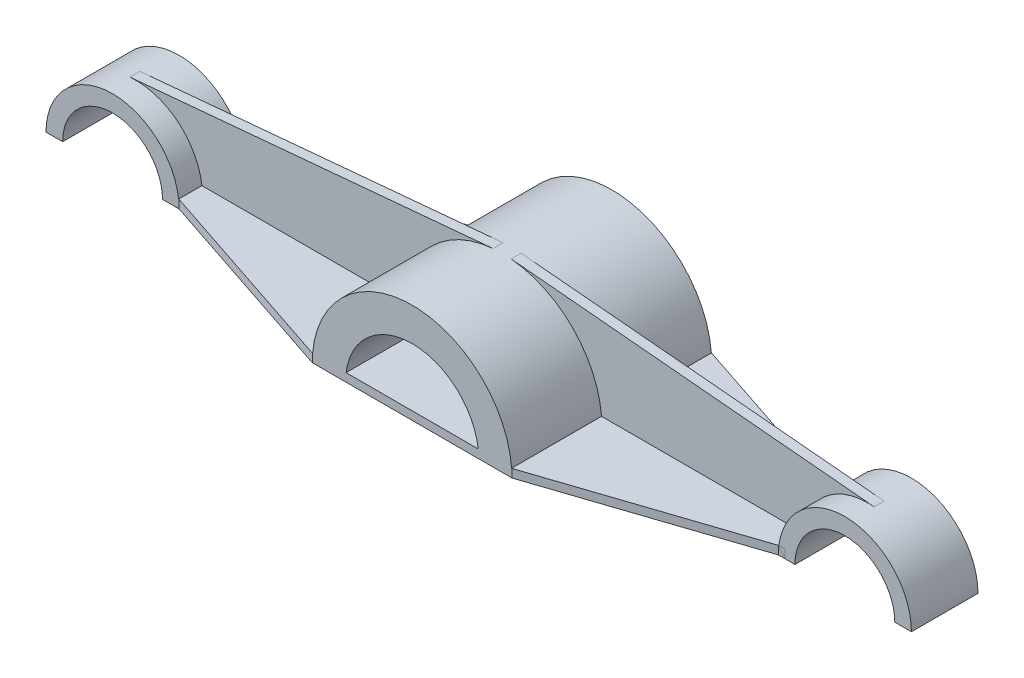
ISO-10303-21;
HEADER;
FILE_DESCRIPTION(('STEP AP214'),'2;1');
FILE_NAME('part.step','',(''),(''),'','','');
FILE_SCHEMA(('AUTOMOTIVE_DESIGN { 1 0 10303 214 1 1 1 1 }'));
ENDSEC;
DATA;
#1=APPLICATION_CONTEXT('core data for automotive mechanical design processes');
#2=APPLICATION_PROTOCOL_DEFINITION('international standard','automotive_design',2000,#1);
#3=PRODUCT_CONTEXT('',#1,'mechanical');
#4=PRODUCT('Part','Part','',(#3));
#5=PRODUCT_RELATED_PRODUCT_CATEGORY('part','',(#4));
#6=PRODUCT_DEFINITION_FORMATION('','',#4);
#7=PRODUCT_DEFINITION_CONTEXT('part definition',#1,'design');
#8=PRODUCT_DEFINITION('design','',#6,#7);
#9=PRODUCT_DEFINITION_SHAPE('','',#8);
#10=(LENGTH_UNIT() NAMED_UNIT(*) SI_UNIT(.MILLI.,.METRE.));
#11=(NAMED_UNIT(*) PLANE_ANGLE_UNIT() SI_UNIT($,.RADIAN.));
#12=(NAMED_UNIT(*) SI_UNIT($,.STERADIAN.) SOLID_ANGLE_UNIT());
#13=UNCERTAINTY_MEASURE_WITH_UNIT(LENGTH_MEASURE(1.E-05),#10,'distance_accuracy_value','');
#14=(GEOMETRIC_REPRESENTATION_CONTEXT(3) GLOBAL_UNCERTAINTY_ASSIGNED_CONTEXT((#13)) GLOBAL_UNIT_ASSIGNED_CONTEXT((#10,
#11,#12)) REPRESENTATION_CONTEXT('',''));
#15=CARTESIAN_POINT('',(0.,0.,0.));
#16=DIRECTION('',(0.,0.,1.));
#17=DIRECTION('',(1.,0.,0.));
#18=AXIS2_PLACEMENT_3D('',#15,#16,#17);
#19=CARTESIAN_POINT('',(90.,0.,10.));
#20=DIRECTION('',(0.,1.,0.));
#21=DIRECTION('',(0.,0.,1.));
#22=AXIS2_PLACEMENT_3D('',#19,#20,#21);
#23=PLANE('',#22);
#24=DIRECTION('',(1.,0.,0.));
#25=VECTOR('',#24,1.);
#26=CARTESIAN_POINT('',(90.,0.,-10.));
#27=LINE('',#26,#25);
#28=CARTESIAN_POINT('',(90.,0.,-10.));
#29=VERTEX_POINT('',#28);
#30=CARTESIAN_POINT('',(95.,0.,-10.));
#31=VERTEX_POINT('',#30);
#32=EDGE_CURVE('E118',#29,#31,#27,.T.);
#33=ORIENTED_EDGE('',*,*,#32,.T.);
#34=DIRECTION('',(0.,0.,-1.));
#35=VECTOR('',#34,1.);
#36=CARTESIAN_POINT('',(95.,0.,10.));
#37=LINE('',#36,#35);
#38=CARTESIAN_POINT('',(95.,0.,10.));
#39=VERTEX_POINT('',#38);
#40=EDGE_CURVE('E12',#39,#31,#37,.T.);
#41=ORIENTED_EDGE('',*,*,#40,.F.);
#42=DIRECTION('',(1.,0.,0.));
#43=VECTOR('',#42,1.);
#44=CARTESIAN_POINT('',(90.,0.,10.));
#45=LINE('',#44,#43);
#46=CARTESIAN_POINT('',(90.,0.,10.));
#47=VERTEX_POINT('',#46);
#48=EDGE_CURVE('E104',#47,#39,#45,.T.);
#49=ORIENTED_EDGE('',*,*,#48,.F.);
#50=DIRECTION('',(0.,0.,-1.));
#51=VECTOR('',#50,1.);
#52=CARTESIAN_POINT('',(90.,0.,10.));
#53=LINE('',#52,#51);
#54=EDGE_CURVE('E71',#47,#29,#53,.T.);
#55=ORIENTED_EDGE('',*,*,#54,.T.);
#56=EDGE_LOOP('',(#33,#41,#49,#55));
#57=FACE_BOUND('',#56,.T.);
#58=ADVANCED_FACE('F55',(#57),#23,.F.);
#59=CARTESIAN_POINT('',(110.,0.,10.));
#60=DIRECTION('',(0.,0.,-1.));
#61=DIRECTION('',(-1.,0.,0.));
#62=AXIS2_PLACEMENT_3D('',#59,#60,#61);
#63=CYLINDRICAL_SURFACE('',#62,15.);
#64=CARTESIAN_POINT('',(110.,0.,-10.));
#65=DIRECTION('',(0.,0.,-1.));
#66=DIRECTION('',(-1.,0.,0.));
#67=AXIS2_PLACEMENT_3D('',#64,#65,#66);
#68=CIRCLE('',#67,15.);
#69=CARTESIAN_POINT('',(125.,0.,-10.));
#70=VERTEX_POINT('',#69);
#71=EDGE_CURVE('E109',#31,#70,#68,.T.);
#72=ORIENTED_EDGE('',*,*,#71,.T.);
#73=DIRECTION('',(0.,0.,-1.));
#74=VECTOR('',#73,1.);
#75=CARTESIAN_POINT('',(125.,0.,10.));
#76=LINE('',#75,#74);
#77=CARTESIAN_POINT('',(125.,0.,10.));
#78=VERTEX_POINT('',#77);
#79=EDGE_CURVE('E63',#78,#70,#76,.T.);
#80=ORIENTED_EDGE('',*,*,#79,.F.);
#81=CARTESIAN_POINT('',(110.,0.,10.));
#82=DIRECTION('',(0.,0.,-1.));
#83=DIRECTION('',(-1.,0.,0.));
#84=AXIS2_PLACEMENT_3D('',#81,#82,#83);
#85=CIRCLE('',#84,15.);
#86=EDGE_CURVE('E97',#39,#78,#85,.T.);
#87=ORIENTED_EDGE('',*,*,#86,.F.);
#88=ORIENTED_EDGE('',*,*,#40,.T.);
#89=EDGE_LOOP('',(#72,#80,#87,#88));
#90=FACE_BOUND('',#89,.T.);
#91=ADVANCED_FACE('F108',(#90),#63,.F.);
#92=CARTESIAN_POINT('',(125.,0.,10.));
#93=DIRECTION('',(0.,1.,0.));
#94=DIRECTION('',(0.,0.,1.));
#95=AXIS2_PLACEMENT_3D('',#92,#93,#94);
#96=PLANE('',#95);
#97=DIRECTION('',(1.,0.,0.));
#98=VECTOR('',#97,1.);
#99=CARTESIAN_POINT('',(125.,0.,-10.));
#100=LINE('',#99,#98);
#101=CARTESIAN_POINT('',(130.,0.,-10.));
#102=VERTEX_POINT('',#101);
#103=EDGE_CURVE('E121',#70,#102,#100,.T.);
#104=ORIENTED_EDGE('',*,*,#103,.T.);
#105=DIRECTION('',(0.,0.,-1.));
#106=VECTOR('',#105,1.);
#107=CARTESIAN_POINT('',(130.,0.,10.));
#108=LINE('',#107,#106);
#109=CARTESIAN_POINT('',(130.,0.,10.));
#110=VERTEX_POINT('',#109);
#111=EDGE_CURVE('E86',#110,#102,#108,.T.);
#112=ORIENTED_EDGE('',*,*,#111,.F.);
#113=DIRECTION('',(1.,0.,0.));
#114=VECTOR('',#113,1.);
#115=CARTESIAN_POINT('',(125.,0.,10.));
#116=LINE('',#115,#114);
#117=EDGE_CURVE('E103',#78,#110,#116,.T.);
#118=ORIENTED_EDGE('',*,*,#117,.F.);
#119=ORIENTED_EDGE('',*,*,#79,.T.);
#120=EDGE_LOOP('',(#104,#112,#118,#119));
#121=FACE_BOUND('',#120,.T.);
#122=ADVANCED_FACE('F112',(#121),#96,.F.);
#123=CARTESIAN_POINT('',(110.,0.,10.));
#124=DIRECTION('',(0.,0.,-1.));
#125=DIRECTION('',(-1.,0.,0.));
#126=AXIS2_PLACEMENT_3D('',#123,#124,#125);
#127=CYLINDRICAL_SURFACE('',#126,20.);
#128=CARTESIAN_POINT('',(110.,0.,-10.));
#129=DIRECTION('',(0.,0.,-1.));
#130=DIRECTION('',(-1.,0.,0.));
#131=AXIS2_PLACEMENT_3D('',#128,#129,#130);
#132=CIRCLE('',#131,20.);
#133=EDGE_CURVE('E123',#29,#102,#132,.T.);
#134=ORIENTED_EDGE('',*,*,#133,.F.);
#135=ORIENTED_EDGE('',*,*,#54,.F.);
#136=CARTESIAN_POINT('',(110.,0.,10.));
#137=DIRECTION('',(0.,0.,-1.));
#138=DIRECTION('',(-1.,0.,0.));
#139=AXIS2_PLACEMENT_3D('',#136,#137,#138);
#140=CIRCLE('',#139,20.);
#141=EDGE_CURVE('E113',#47,#110,#140,.T.);
#142=ORIENTED_EDGE('',*,*,#141,.T.);
#143=ORIENTED_EDGE('',*,*,#111,.T.);
#144=EDGE_LOOP('',(#134,#135,#142,#143));
#145=FACE_BOUND('',#144,.T.);
#146=ADVANCED_FACE('F129',(#145),#127,.T.);
#147=CARTESIAN_POINT('',(110.,0.,10.));
#148=DIRECTION('',(0.,0.,-1.));
#149=DIRECTION('',(-1.,0.,0.));
#150=AXIS2_PLACEMENT_3D('',#147,#148,#149);
#151=PLANE('',#150);
#152=ORIENTED_EDGE('',*,*,#48,.T.);
#153=ORIENTED_EDGE('',*,*,#86,.T.);
#154=ORIENTED_EDGE('',*,*,#117,.T.);
#155=ORIENTED_EDGE('',*,*,#141,.F.);
#156=EDGE_LOOP('',(#152,#153,#154,#155));
#157=FACE_BOUND('',#156,.T.);
#158=ADVANCED_FACE('F100',(#157),#151,.F.);
#159=CARTESIAN_POINT('',(110.,0.,-10.));
#160=DIRECTION('',(0.,0.,-1.));
#161=DIRECTION('',(-1.,0.,0.));
#162=AXIS2_PLACEMENT_3D('',#159,#160,#161);
#163=PLANE('',#162);
#164=ORIENTED_EDGE('',*,*,#32,.F.);
#165=ORIENTED_EDGE('',*,*,#133,.T.);
#166=ORIENTED_EDGE('',*,*,#103,.F.);
#167=ORIENTED_EDGE('',*,*,#71,.F.);
#168=EDGE_LOOP('',(#164,#165,#166,#167));
#169=FACE_BOUND('',#168,.T.);
#170=ADVANCED_FACE('F128',(#169),#163,.T.);
#171=CLOSED_SHELL('',(#58,#91,#122,#146,#158,#170));
#172=MANIFOLD_SOLID_BREP('B2',#171);
#173=CARTESIAN_POINT('',(-95.,0.,10.));
#174=DIRECTION('',(0.,1.,0.));
#175=DIRECTION('',(0.,0.,1.));
#176=AXIS2_PLACEMENT_3D('',#173,#174,#175);
#177=PLANE('',#176);
#178=DIRECTION('',(1.,0.,0.));
#179=VECTOR('',#178,1.);
#180=CARTESIAN_POINT('',(-95.,0.,-10.));
#181=LINE('',#180,#179);
#182=CARTESIAN_POINT('',(-95.,0.,-10.));
#183=VERTEX_POINT('',#182);
#184=CARTESIAN_POINT('',(-90.,0.,-10.));
#185=VERTEX_POINT('',#184);
#186=EDGE_CURVE('E564',#183,#185,#181,.T.);
#187=ORIENTED_EDGE('',*,*,#186,.T.);
#188=DIRECTION('',(-0.948683298050514,0.,0.316227766016838));
#189=VECTOR('',#188,1.);
#190=CARTESIAN_POINT('',(-90.,0.,-10.));
#191=LINE('',#190,#189);
#192=CARTESIAN_POINT('',(-30.,0.,-30.));
#193=VERTEX_POINT('',#192);
#194=EDGE_CURVE('E392',#193,#185,#191,.T.);
#195=ORIENTED_EDGE('',*,*,#194,.F.);
#196=DIRECTION('',(1.,0.,0.));
#197=VECTOR('',#196,1.);
#198=CARTESIAN_POINT('',(-30.,0.,-30.));
#199=LINE('',#198,#197);
#200=CARTESIAN_POINT('',(30.,0.,-30.));
#201=VERTEX_POINT('',#200);
#202=EDGE_CURVE('E522',#193,#201,#199,.T.);
#203=ORIENTED_EDGE('',*,*,#202,.T.);
#204=DIRECTION('',(-0.948683298050514,0.,-0.316227766016838));
#205=VECTOR('',#204,1.);
#206=CARTESIAN_POINT('',(30.,0.,-30.));
#207=LINE('',#206,#205);
#208=CARTESIAN_POINT('',(90.,0.,-10.));
#209=VERTEX_POINT('',#208);
#210=EDGE_CURVE('E444',#209,#201,#207,.T.);
#211=ORIENTED_EDGE('',*,*,#210,.F.);
#212=DIRECTION('',(-1.,0.,0.));
#213=VECTOR('',#212,1.);
#214=CARTESIAN_POINT('',(90.,0.,-10.));
#215=LINE('',#214,#213);
#216=CARTESIAN_POINT('',(92.,0.,-10.));
#217=VERTEX_POINT('',#216);
#218=EDGE_CURVE('E441',#217,#209,#215,.T.);
#219=ORIENTED_EDGE('',*,*,#218,.F.);
#220=DIRECTION('',(0.,0.,-1.));
#221=VECTOR('',#220,1.);
#222=CARTESIAN_POINT('',(92.,0.,-10.));
#223=LINE('',#222,#221);
#224=CARTESIAN_POINT('',(92.,0.,10.));
#225=VERTEX_POINT('',#224);
#226=EDGE_CURVE('E438',#225,#217,#223,.T.);
#227=ORIENTED_EDGE('',*,*,#226,.F.);
#228=DIRECTION('',(1.,0.,0.));
#229=VECTOR('',#228,1.);
#230=CARTESIAN_POINT('',(92.,0.,10.));
#231=LINE('',#230,#229);
#232=CARTESIAN_POINT('',(90.,0.,10.));
#233=VERTEX_POINT('',#232);
#234=EDGE_CURVE('E435',#233,#225,#231,.T.);
#235=ORIENTED_EDGE('',*,*,#234,.F.);
#236=DIRECTION('',(0.948683298050514,0.,-0.316227766016838));
#237=VECTOR('',#236,1.);
#238=CARTESIAN_POINT('',(90.,0.,10.));
#239=LINE('',#238,#237);
#240=CARTESIAN_POINT('',(30.,0.,30.));
#241=VERTEX_POINT('',#240);
#242=EDGE_CURVE('E432',#241,#233,#239,.T.);
#243=ORIENTED_EDGE('',*,*,#242,.F.);
#244=DIRECTION('',(1.,0.,0.));
#245=VECTOR('',#244,1.);
#246=CARTESIAN_POINT('',(20.,0.,30.));
#247=LINE('',#246,#245);
#248=CARTESIAN_POINT('',(-30.,0.,30.));
#249=VERTEX_POINT('',#248);
#250=EDGE_CURVE('E508',#249,#241,#247,.T.);
#251=ORIENTED_EDGE('',*,*,#250,.F.);
#252=DIRECTION('',(0.948683298050514,0.,0.316227766016838));
#253=VECTOR('',#252,1.);
#254=CARTESIAN_POINT('',(-30.,0.,30.));
#255=LINE('',#254,#253);
#256=CARTESIAN_POINT('',(-90.,0.,10.));
#257=VERTEX_POINT('',#256);
#258=EDGE_CURVE('E360',#257,#249,#255,.T.);
#259=ORIENTED_EDGE('',*,*,#258,.F.);
#260=DIRECTION('',(1.,0.,0.));
#261=VECTOR('',#260,1.);
#262=CARTESIAN_POINT('',(-95.,0.,10.));
#263=LINE('',#262,#261);
#264=CARTESIAN_POINT('',(-95.,0.,10.));
#265=VERTEX_POINT('',#264);
#266=EDGE_CURVE('E565',#265,#257,#263,.T.);
#267=ORIENTED_EDGE('',*,*,#266,.F.);
#268=DIRECTION('',(0.,0.,-1.));
#269=VECTOR('',#268,1.);
#270=CARTESIAN_POINT('',(-95.,0.,10.));
#271=LINE('',#270,#269);
#272=EDGE_CURVE('E579',#265,#183,#271,.T.);
#273=ORIENTED_EDGE('',*,*,#272,.T.);
#274=EDGE_LOOP('',(#187,#195,#203,#211,#219,#227,#235,#243,#251,#259,#267,#273));
#275=FACE_BOUND('',#274,.T.);
#276=ADVANCED_FACE('F179',(#275),#177,.F.);
#277=CARTESIAN_POINT('',(-110.,0.,10.));
#278=DIRECTION('',(0.,0.,-1.));
#279=DIRECTION('',(-1.,0.,0.));
#280=AXIS2_PLACEMENT_3D('',#277,#278,#279);
#281=CYLINDRICAL_SURFACE('',#280,20.);
#282=CARTESIAN_POINT('',(-110.,0.,10.));
#283=DIRECTION('',(0.,0.,1.));
#284=DIRECTION('',(1.,0.,0.));
#285=AXIS2_PLACEMENT_3D('',#282,#283,#284);
#286=CIRCLE('',#285,20.);
#287=CARTESIAN_POINT('',(-90.1568651670156,2.5,10.));
#288=VERTEX_POINT('',#287);
#289=CARTESIAN_POINT('',(-130.,0.,10.));
#290=VERTEX_POINT('',#289);
#291=EDGE_CURVE('E568',#288,#290,#286,.T.);
#292=ORIENTED_EDGE('',*,*,#291,.F.);
#293=DIRECTION('',(0.,0.,-1.));
#294=VECTOR('',#293,1.);
#295=CARTESIAN_POINT('',(-90.1568651670156,2.5,10.));
#296=LINE('',#295,#294);
#297=CARTESIAN_POINT('',(-90.1568651670156,2.5,3.));
#298=VERTEX_POINT('',#297);
#299=EDGE_CURVE('E531',#288,#298,#296,.T.);
#300=ORIENTED_EDGE('',*,*,#299,.T.);
#301=CARTESIAN_POINT('',(-110.,0.,3.));
#302=DIRECTION('',(0.,0.,-1.));
#303=DIRECTION('',(1.,0.,0.));
#304=AXIS2_PLACEMENT_3D('',#301,#302,#303);
#305=CIRCLE('',#304,20.);
#306=CARTESIAN_POINT('',(-111.818181818182,19.9171839092788,3.));
#307=VERTEX_POINT('',#306);
#308=EDGE_CURVE('E543',#307,#298,#305,.T.);
#309=ORIENTED_EDGE('',*,*,#308,.F.);
#310=DIRECTION('',(0.,0.,-1.));
#311=VECTOR('',#310,1.);
#312=CARTESIAN_POINT('',(-111.818181818182,19.9171839092788,3.));
#313=LINE('',#312,#311);
#314=CARTESIAN_POINT('',(-111.818181818182,19.9171839092788,0.));
#315=VERTEX_POINT('',#314);
#316=EDGE_CURVE('E548',#307,#315,#313,.T.);
#317=ORIENTED_EDGE('',*,*,#316,.T.);
#318=CARTESIAN_POINT('',(-110.,0.,0.));
#319=DIRECTION('',(0.,0.,-1.));
#320=DIRECTION('',(1.,0.,0.));
#321=AXIS2_PLACEMENT_3D('',#318,#319,#320);
#322=CIRCLE('',#321,20.);
#323=CARTESIAN_POINT('',(-90.1568651670156,2.5,0.));
#324=VERTEX_POINT('',#323);
#325=EDGE_CURVE('E544',#315,#324,#322,.T.);
#326=ORIENTED_EDGE('',*,*,#325,.T.);
#327=CARTESIAN_POINT('',(-90.1568651670156,2.5,-10.));
#328=VERTEX_POINT('',#327);
#329=EDGE_CURVE('E202',#324,#328,#296,.T.);
#330=ORIENTED_EDGE('',*,*,#329,.T.);
#331=CARTESIAN_POINT('',(-110.,0.,-10.));
#332=DIRECTION('',(0.,0.,1.));
#333=DIRECTION('',(1.,0.,0.));
#334=AXIS2_PLACEMENT_3D('',#331,#332,#333);
#335=CIRCLE('',#334,20.);
#336=CARTESIAN_POINT('',(-130.,0.,-10.));
#337=VERTEX_POINT('',#336);
#338=EDGE_CURVE('E582',#328,#337,#335,.T.);
#339=ORIENTED_EDGE('',*,*,#338,.T.);
#340=DIRECTION('',(0.,0.,-1.));
#341=VECTOR('',#340,1.);
#342=CARTESIAN_POINT('',(-130.,0.,10.));
#343=LINE('',#342,#341);
#344=EDGE_CURVE('E597',#290,#337,#343,.T.);
#345=ORIENTED_EDGE('',*,*,#344,.F.);
#346=EDGE_LOOP('',(#292,#300,#309,#317,#326,#330,#339,#345));
#347=FACE_BOUND('',#346,.T.);
#348=ADVANCED_FACE('F649',(#347),#281,.T.);
#349=CARTESIAN_POINT('',(-130.,0.,10.));
#350=DIRECTION('',(0.,1.,0.));
#351=DIRECTION('',(0.,0.,1.));
#352=AXIS2_PLACEMENT_3D('',#349,#350,#351);
#353=PLANE('',#352);
#354=DIRECTION('',(1.,0.,0.));
#355=VECTOR('',#354,1.);
#356=CARTESIAN_POINT('',(-130.,0.,-10.));
#357=LINE('',#356,#355);
#358=CARTESIAN_POINT('',(-125.,0.,-10.));
#359=VERTEX_POINT('',#358);
#360=EDGE_CURVE('E585',#337,#359,#357,.T.);
#361=ORIENTED_EDGE('',*,*,#360,.T.);
#362=DIRECTION('',(0.,0.,-1.));
#363=VECTOR('',#362,1.);
#364=CARTESIAN_POINT('',(-125.,0.,10.));
#365=LINE('',#364,#363);
#366=CARTESIAN_POINT('',(-125.,0.,10.));
#367=VERTEX_POINT('',#366);
#368=EDGE_CURVE('E594',#367,#359,#365,.T.);
#369=ORIENTED_EDGE('',*,*,#368,.F.);
#370=DIRECTION('',(1.,0.,0.));
#371=VECTOR('',#370,1.);
#372=CARTESIAN_POINT('',(-130.,0.,10.));
#373=LINE('',#372,#371);
#374=EDGE_CURVE('E572',#290,#367,#373,.T.);
#375=ORIENTED_EDGE('',*,*,#374,.F.);
#376=ORIENTED_EDGE('',*,*,#344,.T.);
#377=EDGE_LOOP('',(#361,#369,#375,#376));
#378=FACE_BOUND('',#377,.T.);
#379=ADVANCED_FACE('F656',(#378),#353,.F.);
#380=CARTESIAN_POINT('',(-110.,0.,10.));
#381=DIRECTION('',(0.,0.,-1.));
#382=DIRECTION('',(-1.,0.,0.));
#383=AXIS2_PLACEMENT_3D('',#380,#381,#382);
#384=CYLINDRICAL_SURFACE('',#383,15.);
#385=CARTESIAN_POINT('',(-110.,0.,-10.));
#386=DIRECTION('',(0.,0.,1.));
#387=DIRECTION('',(1.,0.,0.));
#388=AXIS2_PLACEMENT_3D('',#385,#386,#387);
#389=CIRCLE('',#388,15.);
#390=EDGE_CURVE('E569',#183,#359,#389,.T.);
#391=ORIENTED_EDGE('',*,*,#390,.F.);
#392=ORIENTED_EDGE('',*,*,#272,.F.);
#393=CARTESIAN_POINT('',(-110.,0.,10.));
#394=DIRECTION('',(0.,0.,1.));
#395=DIRECTION('',(1.,0.,0.));
#396=AXIS2_PLACEMENT_3D('',#393,#394,#395);
#397=CIRCLE('',#396,15.);
#398=EDGE_CURVE('E575',#265,#367,#397,.T.);
#399=ORIENTED_EDGE('',*,*,#398,.T.);
#400=ORIENTED_EDGE('',*,*,#368,.T.);
#401=EDGE_LOOP('',(#391,#392,#399,#400));
#402=FACE_BOUND('',#401,.T.);
#403=ADVANCED_FACE('F741',(#402),#384,.F.);
#404=CARTESIAN_POINT('',(-110.,0.,10.));
#405=DIRECTION('',(0.,0.,1.));
#406=DIRECTION('',(1.,0.,0.));
#407=AXIS2_PLACEMENT_3D('',#404,#405,#406);
#408=PLANE('',#407);
#409=ORIENTED_EDGE('',*,*,#266,.T.);
#410=DIRECTION('',(0.,-1.,0.));
#411=VECTOR('',#410,1.);
#412=CARTESIAN_POINT('',(-90.,2.5,10.));
#413=LINE('',#412,#411);
#414=CARTESIAN_POINT('',(-90.,2.5,10.));
#415=VERTEX_POINT('',#414);
#416=EDGE_CURVE('E486',#415,#257,#413,.T.);
#417=ORIENTED_EDGE('',*,*,#416,.F.);
#418=DIRECTION('',(1.,0.,0.));
#419=VECTOR('',#418,1.);
#420=CARTESIAN_POINT('',(-92.,2.5,10.));
#421=LINE('',#420,#419);
#422=EDGE_CURVE('E391',#288,#415,#421,.T.);
#423=ORIENTED_EDGE('',*,*,#422,.F.);
#424=ORIENTED_EDGE('',*,*,#291,.T.);
#425=ORIENTED_EDGE('',*,*,#374,.T.);
#426=ORIENTED_EDGE('',*,*,#398,.F.);
#427=EDGE_LOOP('',(#409,#417,#423,#424,#425,#426));
#428=FACE_BOUND('',#427,.T.);
#429=ADVANCED_FACE('F736',(#428),#408,.T.);
#430=CARTESIAN_POINT('',(-110.,0.,-10.));
#431=DIRECTION('',(0.,0.,1.));
#432=DIRECTION('',(1.,0.,0.));
#433=AXIS2_PLACEMENT_3D('',#430,#431,#432);
#434=PLANE('',#433);
#435=DIRECTION('',(0.,-1.,0.));
#436=VECTOR('',#435,1.);
#437=CARTESIAN_POINT('',(-90.,2.5,-10.));
#438=LINE('',#437,#436);
#439=CARTESIAN_POINT('',(-90.,2.5,-10.));
#440=VERTEX_POINT('',#439);
#441=EDGE_CURVE('E428',#440,#185,#438,.T.);
#442=ORIENTED_EDGE('',*,*,#441,.T.);
#443=ORIENTED_EDGE('',*,*,#186,.F.);
#444=ORIENTED_EDGE('',*,*,#390,.T.);
#445=ORIENTED_EDGE('',*,*,#360,.F.);
#446=ORIENTED_EDGE('',*,*,#338,.F.);
#447=DIRECTION('',(-1.,0.,0.));
#448=VECTOR('',#447,1.);
#449=CARTESIAN_POINT('',(-90.,2.5,-10.));
#450=LINE('',#449,#448);
#451=EDGE_CURVE('E388',#440,#328,#450,.T.);
#452=ORIENTED_EDGE('',*,*,#451,.F.);
#453=EDGE_LOOP('',(#442,#443,#444,#445,#446,#452));
#454=FACE_BOUND('',#453,.T.);
#455=ADVANCED_FACE('F669',(#454),#434,.F.);
#456=CARTESIAN_POINT('',(-111.818181818182,19.9171839092788,3.));
#457=DIRECTION('',(0.0909090909090909,-0.995859195463938,0.));
#458=DIRECTION('',(0.995859195463939,0.0909090909090909,0.));
#459=AXIS2_PLACEMENT_3D('',#456,#457,#458);
#460=PLANE('',#459);
#461=DIRECTION('',(-0.995859195463939,-0.0909090909090909,0.));
#462=VECTOR('',#461,1.);
#463=CARTESIAN_POINT('',(-111.818181818182,19.9171839092788,0.));
#464=LINE('',#463,#462);
#465=CARTESIAN_POINT('',(-2.72727272727273,29.8757758639182,0.));
#466=VERTEX_POINT('',#465);
#467=EDGE_CURVE('E551',#466,#315,#464,.T.);
#468=ORIENTED_EDGE('',*,*,#467,.T.);
#469=ORIENTED_EDGE('',*,*,#316,.F.);
#470=DIRECTION('',(-0.995859195463939,-0.0909090909090909,0.));
#471=VECTOR('',#470,1.);
#472=CARTESIAN_POINT('',(-111.818181818182,19.9171839092788,3.));
#473=LINE('',#472,#471);
#474=CARTESIAN_POINT('',(-2.72727272727273,29.8757758639182,3.));
#475=VERTEX_POINT('',#474);
#476=EDGE_CURVE('E539',#475,#307,#473,.T.);
#477=ORIENTED_EDGE('',*,*,#476,.F.);
#478=DIRECTION('',(0.,0.,-1.));
#479=VECTOR('',#478,1.);
#480=CARTESIAN_POINT('',(-2.72727272727273,29.8757758639182,3.));
#481=LINE('',#480,#479);
#482=EDGE_CURVE('E560',#475,#466,#481,.T.);
#483=ORIENTED_EDGE('',*,*,#482,.T.);
#484=EDGE_LOOP('',(#468,#469,#477,#483));
#485=FACE_BOUND('',#484,.T.);
#486=ADVANCED_FACE('F748',(#485),#460,.F.);
#487=CARTESIAN_POINT('',(0.,0.,3.));
#488=DIRECTION('',(0.,0.,1.));
#489=DIRECTION('',(1.,0.,0.));
#490=AXIS2_PLACEMENT_3D('',#487,#488,#489);
#491=PLANE('',#490);
#492=DIRECTION('',(-1.,0.,0.));
#493=VECTOR('',#492,1.);
#494=CARTESIAN_POINT('',(0.,2.5,3.));
#495=LINE('',#494,#493);
#496=CARTESIAN_POINT('',(-29.8956518577535,2.5,3.));
#497=VERTEX_POINT('',#496);
#498=EDGE_CURVE('E530',#497,#298,#495,.T.);
#499=ORIENTED_EDGE('',*,*,#498,.F.);
#500=CARTESIAN_POINT('',(0.,0.,3.));
#501=DIRECTION('',(0.,0.,1.));
#502=DIRECTION('',(1.,0.,0.));
#503=AXIS2_PLACEMENT_3D('',#500,#501,#502);
#504=CIRCLE('',#503,30.);
#505=EDGE_CURVE('E534',#497,#475,#504,.F.);
#506=ORIENTED_EDGE('',*,*,#505,.T.);
#507=ORIENTED_EDGE('',*,*,#476,.T.);
#508=ORIENTED_EDGE('',*,*,#308,.T.);
#509=EDGE_LOOP('',(#499,#506,#507,#508));
#510=FACE_BOUND('',#509,.T.);
#511=ADVANCED_FACE('F745',(#510),#491,.T.);
#512=CARTESIAN_POINT('',(0.,0.,0.));
#513=DIRECTION('',(0.,0.,1.));
#514=DIRECTION('',(1.,0.,0.));
#515=AXIS2_PLACEMENT_3D('',#512,#513,#514);
#516=PLANE('',#515);
#517=CARTESIAN_POINT('',(0.,0.,0.));
#518=DIRECTION('',(0.,0.,-1.));
#519=DIRECTION('',(1.,0.,0.));
#520=AXIS2_PLACEMENT_3D('',#517,#518,#519);
#521=CIRCLE('',#520,30.);
#522=CARTESIAN_POINT('',(-29.8956518577535,2.5,0.));
#523=VERTEX_POINT('',#522);
#524=EDGE_CURVE('E538',#523,#466,#521,.T.);
#525=ORIENTED_EDGE('',*,*,#524,.F.);
#526=DIRECTION('',(-1.,0.,0.));
#527=VECTOR('',#526,1.);
#528=CARTESIAN_POINT('',(0.,2.5,0.));
#529=LINE('',#528,#527);
#530=EDGE_CURVE('E601',#523,#324,#529,.T.);
#531=ORIENTED_EDGE('',*,*,#530,.T.);
#532=ORIENTED_EDGE('',*,*,#325,.F.);
#533=ORIENTED_EDGE('',*,*,#467,.F.);
#534=EDGE_LOOP('',(#525,#531,#532,#533));
#535=FACE_BOUND('',#534,.T.);
#536=ADVANCED_FACE('F680',(#535),#516,.F.);
#537=CARTESIAN_POINT('',(0.,2.5,0.));
#538=DIRECTION('',(0.,1.,0.));
#539=DIRECTION('',(0.,0.,1.));
#540=AXIS2_PLACEMENT_3D('',#537,#538,#539);
#541=PLANE('',#540);
#542=ORIENTED_EDGE('',*,*,#299,.F.);
#543=ORIENTED_EDGE('',*,*,#422,.T.);
#544=DIRECTION('',(0.948683298050514,0.,0.316227766016838));
#545=VECTOR('',#544,1.);
#546=CARTESIAN_POINT('',(-30.,2.5,30.));
#547=LINE('',#546,#545);
#548=CARTESIAN_POINT('',(-30.,2.5,30.));
#549=VERTEX_POINT('',#548);
#550=EDGE_CURVE('E395',#415,#549,#547,.T.);
#551=ORIENTED_EDGE('',*,*,#550,.T.);
#552=DIRECTION('',(1.,0.,0.));
#553=VECTOR('',#552,1.);
#554=CARTESIAN_POINT('',(30.,2.5,30.));
#555=LINE('',#554,#553);
#556=CARTESIAN_POINT('',(-29.8956518577535,2.5,30.));
#557=VERTEX_POINT('',#556);
#558=EDGE_CURVE('E399',#549,#557,#555,.T.);
#559=ORIENTED_EDGE('',*,*,#558,.T.);
#560=DIRECTION('',(0.,0.,-1.));
#561=VECTOR('',#560,1.);
#562=CARTESIAN_POINT('',(-29.8956518577535,2.5,30.));
#563=LINE('',#562,#561);
#564=EDGE_CURVE('E497',#497,#557,#563,.F.);
#565=ORIENTED_EDGE('',*,*,#564,.F.);
#566=ORIENTED_EDGE('',*,*,#498,.T.);
#567=EDGE_LOOP('',(#542,#543,#551,#559,#565,#566));
#568=FACE_BOUND('',#567,.T.);
#569=ADVANCED_FACE('F726',(#568),#541,.T.);
#570=ORIENTED_EDGE('',*,*,#329,.F.);
#571=ORIENTED_EDGE('',*,*,#530,.F.);
#572=CARTESIAN_POINT('',(-29.8956518577535,2.5,-30.));
#573=VERTEX_POINT('',#572);
#574=EDGE_CURVE('E498',#573,#523,#563,.F.);
#575=ORIENTED_EDGE('',*,*,#574,.F.);
#576=DIRECTION('',(-1.,0.,0.));
#577=VECTOR('',#576,1.);
#578=CARTESIAN_POINT('',(-30.,2.5,-30.));
#579=LINE('',#578,#577);
#580=CARTESIAN_POINT('',(-30.,2.5,-30.));
#581=VERTEX_POINT('',#580);
#582=EDGE_CURVE('E419',#573,#581,#579,.T.);
#583=ORIENTED_EDGE('',*,*,#582,.T.);
#584=DIRECTION('',(-0.948683298050514,0.,0.316227766016838));
#585=VECTOR('',#584,1.);
#586=CARTESIAN_POINT('',(-90.,2.5,-10.));
#587=LINE('',#586,#585);
#588=EDGE_CURVE('E424',#581,#440,#587,.T.);
#589=ORIENTED_EDGE('',*,*,#588,.T.);
#590=ORIENTED_EDGE('',*,*,#451,.T.);
#591=EDGE_LOOP('',(#570,#571,#575,#583,#589,#590));
#592=FACE_BOUND('',#591,.T.);
#593=ADVANCED_FACE('F672',(#592),#541,.T.);
#594=CARTESIAN_POINT('',(0.,0.,30.));
#595=DIRECTION('',(0.,0.,-1.));
#596=DIRECTION('',(-1.,0.,0.));
#597=AXIS2_PLACEMENT_3D('',#594,#595,#596);
#598=CYLINDRICAL_SURFACE('',#597,30.);
#599=DIRECTION('',(0.,0.,-1.));
#600=VECTOR('',#599,1.);
#601=CARTESIAN_POINT('',(29.8956518577535,2.5,30.));
#602=LINE('',#601,#600);
#603=CARTESIAN_POINT('',(29.8956518577535,2.5,30.));
#604=VERTEX_POINT('',#603);
#605=CARTESIAN_POINT('',(29.8956518577535,2.5,3.));
#606=VERTEX_POINT('',#605);
#607=EDGE_CURVE('E503',#604,#606,#602,.T.);
#608=ORIENTED_EDGE('',*,*,#607,.T.);
#609=CARTESIAN_POINT('',(0.,0.,3.));
#610=DIRECTION('',(0.,0.,1.));
#611=DIRECTION('',(-1.,0.,0.));
#612=AXIS2_PLACEMENT_3D('',#609,#610,#611);
#613=CIRCLE('',#612,30.);
#614=CARTESIAN_POINT('',(2.72727272727273,29.8757758639182,3.));
#615=VERTEX_POINT('',#614);
#616=EDGE_CURVE('E370',#606,#615,#613,.T.);
#617=ORIENTED_EDGE('',*,*,#616,.T.);
#618=DIRECTION('',(0.,0.,-1.));
#619=VECTOR('',#618,1.);
#620=CARTESIAN_POINT('',(2.72727272727273,29.8757758639182,3.));
#621=LINE('',#620,#619);
#622=CARTESIAN_POINT('',(2.72727272727273,29.8757758639182,0.));
#623=VERTEX_POINT('',#622);
#624=EDGE_CURVE('E361',#615,#623,#621,.T.);
#625=ORIENTED_EDGE('',*,*,#624,.T.);
#626=CARTESIAN_POINT('',(0.,0.,0.));
#627=DIRECTION('',(0.,0.,1.));
#628=DIRECTION('',(-1.,0.,0.));
#629=AXIS2_PLACEMENT_3D('',#626,#627,#628);
#630=CIRCLE('',#629,30.);
#631=CARTESIAN_POINT('',(29.8956518577535,2.5,0.));
#632=VERTEX_POINT('',#631);
#633=EDGE_CURVE('E380',#632,#623,#630,.T.);
#634=ORIENTED_EDGE('',*,*,#633,.F.);
#635=CARTESIAN_POINT('',(29.8956518577535,2.5,-30.));
#636=VERTEX_POINT('',#635);
#637=EDGE_CURVE('E502',#632,#636,#602,.T.);
#638=ORIENTED_EDGE('',*,*,#637,.T.);
#639=CARTESIAN_POINT('',(0.,0.,-30.));
#640=DIRECTION('',(0.,0.,1.));
#641=DIRECTION('',(1.,0.,0.));
#642=AXIS2_PLACEMENT_3D('',#639,#640,#641);
#643=CIRCLE('',#642,30.);
#644=EDGE_CURVE('E507',#636,#573,#643,.T.);
#645=ORIENTED_EDGE('',*,*,#644,.T.);
#646=ORIENTED_EDGE('',*,*,#574,.T.);
#647=ORIENTED_EDGE('',*,*,#524,.T.);
#648=ORIENTED_EDGE('',*,*,#482,.F.);
#649=ORIENTED_EDGE('',*,*,#505,.F.);
#650=ORIENTED_EDGE('',*,*,#564,.T.);
#651=CARTESIAN_POINT('',(0.,0.,30.));
#652=DIRECTION('',(0.,0.,1.));
#653=DIRECTION('',(1.,0.,0.));
#654=AXIS2_PLACEMENT_3D('',#651,#652,#653);
#655=CIRCLE('',#654,30.);
#656=EDGE_CURVE('E511',#604,#557,#655,.T.);
#657=ORIENTED_EDGE('',*,*,#656,.F.);
#658=EDGE_LOOP('',(#608,#617,#625,#634,#638,#645,#646,#647,#648,#649,#650,#657));
#659=FACE_BOUND('',#658,.T.);
#660=ADVANCED_FACE('F614',(#659),#598,.T.);
#661=CARTESIAN_POINT('',(0.,0.,30.));
#662=DIRECTION('',(0.,0.,-1.));
#663=DIRECTION('',(-1.,0.,0.));
#664=AXIS2_PLACEMENT_3D('',#661,#662,#663);
#665=CYLINDRICAL_SURFACE('',#664,20.);
#666=DIRECTION('',(0.,0.,-1.));
#667=VECTOR('',#666,1.);
#668=CARTESIAN_POINT('',(19.8431348329844,2.5,30.));
#669=LINE('',#668,#667);
#670=CARTESIAN_POINT('',(19.8431348329844,2.5,30.));
#671=VERTEX_POINT('',#670);
#672=CARTESIAN_POINT('',(19.8431348329844,2.5,-30.));
#673=VERTEX_POINT('',#672);
#674=EDGE_CURVE('E494',#671,#673,#669,.T.);
#675=ORIENTED_EDGE('',*,*,#674,.F.);
#676=CARTESIAN_POINT('',(0.,0.,30.));
#677=DIRECTION('',(0.,0.,1.));
#678=DIRECTION('',(1.,0.,0.));
#679=AXIS2_PLACEMENT_3D('',#676,#677,#678);
#680=CIRCLE('',#679,20.);
#681=CARTESIAN_POINT('',(-19.8431348329844,2.5,30.));
#682=VERTEX_POINT('',#681);
#683=EDGE_CURVE('E516',#671,#682,#680,.T.);
#684=ORIENTED_EDGE('',*,*,#683,.T.);
#685=DIRECTION('',(0.,0.,-1.));
#686=VECTOR('',#685,1.);
#687=CARTESIAN_POINT('',(-19.8431348329844,2.5,30.));
#688=LINE('',#687,#686);
#689=CARTESIAN_POINT('',(-19.8431348329844,2.5,-30.));
#690=VERTEX_POINT('',#689);
#691=EDGE_CURVE('E490',#690,#682,#688,.F.);
#692=ORIENTED_EDGE('',*,*,#691,.F.);
#693=CARTESIAN_POINT('',(0.,0.,-30.));
#694=DIRECTION('',(0.,0.,1.));
#695=DIRECTION('',(1.,0.,0.));
#696=AXIS2_PLACEMENT_3D('',#693,#694,#695);
#697=CIRCLE('',#696,20.);
#698=EDGE_CURVE('E512',#673,#690,#697,.T.);
#699=ORIENTED_EDGE('',*,*,#698,.F.);
#700=EDGE_LOOP('',(#675,#684,#692,#699));
#701=FACE_BOUND('',#700,.T.);
#702=ADVANCED_FACE('F636',(#701),#665,.F.);
#703=CARTESIAN_POINT('',(0.,0.,30.));
#704=DIRECTION('',(0.,0.,1.));
#705=DIRECTION('',(1.,0.,0.));
#706=AXIS2_PLACEMENT_3D('',#703,#704,#705);
#707=PLANE('',#706);
#708=DIRECTION('',(0.,-1.,0.));
#709=VECTOR('',#708,1.);
#710=CARTESIAN_POINT('',(-30.,2.5,30.));
#711=LINE('',#710,#709);
#712=EDGE_CURVE('E482',#549,#249,#711,.T.);
#713=ORIENTED_EDGE('',*,*,#712,.T.);
#714=ORIENTED_EDGE('',*,*,#250,.T.);
#715=DIRECTION('',(0.,-1.,0.));
#716=VECTOR('',#715,1.);
#717=CARTESIAN_POINT('',(30.,2.5,30.));
#718=LINE('',#717,#716);
#719=CARTESIAN_POINT('',(30.,2.5,30.));
#720=VERTEX_POINT('',#719);
#721=EDGE_CURVE('E478',#720,#241,#718,.T.);
#722=ORIENTED_EDGE('',*,*,#721,.F.);
#723=EDGE_CURVE('E398',#604,#720,#555,.T.);
#724=ORIENTED_EDGE('',*,*,#723,.F.);
#725=ORIENTED_EDGE('',*,*,#656,.T.);
#726=ORIENTED_EDGE('',*,*,#558,.F.);
#727=EDGE_LOOP('',(#713,#714,#722,#724,#725,#726));
#728=FACE_BOUND('',#727,.T.);
#729=ORIENTED_EDGE('',*,*,#683,.F.);
#730=EDGE_CURVE('E404',#682,#671,#555,.T.);
#731=ORIENTED_EDGE('',*,*,#730,.F.);
#732=EDGE_LOOP('',(#729,#731));
#733=FACE_BOUND('',#732,.T.);
#734=ADVANCED_FACE('F621',(#728,#733),#707,.T.);
#735=CARTESIAN_POINT('',(0.,0.,-30.));
#736=DIRECTION('',(0.,0.,1.));
#737=DIRECTION('',(1.,0.,0.));
#738=AXIS2_PLACEMENT_3D('',#735,#736,#737);
#739=PLANE('',#738);
#740=EDGE_CURVE('E425',#673,#690,#579,.T.);
#741=ORIENTED_EDGE('',*,*,#740,.F.);
#742=ORIENTED_EDGE('',*,*,#698,.T.);
#743=EDGE_LOOP('',(#741,#742));
#744=FACE_BOUND('',#743,.T.);
#745=ORIENTED_EDGE('',*,*,#644,.F.);
#746=CARTESIAN_POINT('',(30.,2.5,-30.));
#747=VERTEX_POINT('',#746);
#748=EDGE_CURVE('E420',#747,#636,#579,.T.);
#749=ORIENTED_EDGE('',*,*,#748,.F.);
#750=DIRECTION('',(0.,-1.,0.));
#751=VECTOR('',#750,1.);
#752=CARTESIAN_POINT('',(30.,2.5,-30.));
#753=LINE('',#752,#751);
#754=EDGE_CURVE('E458',#747,#201,#753,.T.);
#755=ORIENTED_EDGE('',*,*,#754,.T.);
#756=ORIENTED_EDGE('',*,*,#202,.F.);
#757=DIRECTION('',(0.,-1.,0.));
#758=VECTOR('',#757,1.);
#759=CARTESIAN_POINT('',(-30.,2.5,-30.));
#760=LINE('',#759,#758);
#761=EDGE_CURVE('E454',#581,#193,#760,.T.);
#762=ORIENTED_EDGE('',*,*,#761,.F.);
#763=ORIENTED_EDGE('',*,*,#582,.F.);
#764=EDGE_LOOP('',(#745,#749,#755,#756,#762,#763));
#765=FACE_BOUND('',#764,.T.);
#766=ADVANCED_FACE('F638',(#744,#765),#739,.F.);
#767=ORIENTED_EDGE('',*,*,#730,.T.);
#768=ORIENTED_EDGE('',*,*,#674,.T.);
#769=ORIENTED_EDGE('',*,*,#740,.T.);
#770=ORIENTED_EDGE('',*,*,#691,.T.);
#771=EDGE_LOOP('',(#767,#768,#769,#770));
#772=FACE_BOUND('',#771,.T.);
#773=ADVANCED_FACE('F630',(#772),#541,.T.);
#774=CARTESIAN_POINT('',(-30.,2.5,30.));
#775=DIRECTION('',(0.316227766016838,0.,-0.948683298050514));
#776=DIRECTION('',(-0.948683298050514,0.,-0.316227766016838));
#777=AXIS2_PLACEMENT_3D('',#774,#775,#776);
#778=PLANE('',#777);
#779=ORIENTED_EDGE('',*,*,#258,.T.);
#780=ORIENTED_EDGE('',*,*,#712,.F.);
#781=ORIENTED_EDGE('',*,*,#550,.F.);
#782=ORIENTED_EDGE('',*,*,#416,.T.);
#783=EDGE_LOOP('',(#779,#780,#781,#782));
#784=FACE_BOUND('',#783,.T.);
#785=ADVANCED_FACE('F719',(#784),#778,.F.);
#786=CARTESIAN_POINT('',(-90.,2.5,-10.));
#787=DIRECTION('',(0.316227766016838,0.,0.948683298050514));
#788=DIRECTION('',(0.948683298050514,0.,-0.316227766016838));
#789=AXIS2_PLACEMENT_3D('',#786,#787,#788);
#790=PLANE('',#789);
#791=ORIENTED_EDGE('',*,*,#194,.T.);
#792=ORIENTED_EDGE('',*,*,#441,.F.);
#793=ORIENTED_EDGE('',*,*,#588,.F.);
#794=ORIENTED_EDGE('',*,*,#761,.T.);
#795=EDGE_LOOP('',(#791,#792,#793,#794));
#796=FACE_BOUND('',#795,.T.);
#797=ADVANCED_FACE('F664',(#796),#790,.F.);
#798=DIRECTION('',(1.,0.,0.));
#799=VECTOR('',#798,1.);
#800=CARTESIAN_POINT('',(0.,2.5,3.));
#801=LINE('',#800,#799);
#802=CARTESIAN_POINT('',(90.1568651670156,2.5,3.));
#803=VERTEX_POINT('',#802);
#804=EDGE_CURVE('E53',#606,#803,#801,.T.);
#805=ORIENTED_EDGE('',*,*,#804,.F.);
#806=ORIENTED_EDGE('',*,*,#607,.F.);
#807=ORIENTED_EDGE('',*,*,#723,.T.);
#808=DIRECTION('',(0.948683298050514,0.,-0.316227766016838));
#809=VECTOR('',#808,1.);
#810=CARTESIAN_POINT('',(90.,2.5,10.));
#811=LINE('',#810,#809);
#812=CARTESIAN_POINT('',(90.,2.5,10.));
#813=VERTEX_POINT('',#812);
#814=EDGE_CURVE('E403',#720,#813,#811,.T.);
#815=ORIENTED_EDGE('',*,*,#814,.T.);
#816=DIRECTION('',(1.,0.,0.));
#817=VECTOR('',#816,1.);
#818=CARTESIAN_POINT('',(92.,2.5,10.));
#819=LINE('',#818,#817);
#820=CARTESIAN_POINT('',(92.,2.5,10.));
#821=VERTEX_POINT('',#820);
#822=EDGE_CURVE('E407',#813,#821,#819,.T.);
#823=ORIENTED_EDGE('',*,*,#822,.T.);
#824=DIRECTION('',(0.,0.,-1.));
#825=VECTOR('',#824,1.);
#826=CARTESIAN_POINT('',(92.,2.5,-10.));
#827=LINE('',#826,#825);
#828=CARTESIAN_POINT('',(92.,2.5,-10.));
#829=VERTEX_POINT('',#828);
#830=EDGE_CURVE('E410',#821,#829,#827,.T.);
#831=ORIENTED_EDGE('',*,*,#830,.T.);
#832=DIRECTION('',(-1.,0.,0.));
#833=VECTOR('',#832,1.);
#834=CARTESIAN_POINT('',(90.,2.5,-10.));
#835=LINE('',#834,#833);
#836=CARTESIAN_POINT('',(90.,2.5,-10.));
#837=VERTEX_POINT('',#836);
#838=EDGE_CURVE('E413',#829,#837,#835,.T.);
#839=ORIENTED_EDGE('',*,*,#838,.T.);
#840=DIRECTION('',(-0.948683298050514,0.,-0.316227766016838));
#841=VECTOR('',#840,1.);
#842=CARTESIAN_POINT('',(30.,2.5,-30.));
#843=LINE('',#842,#841);
#844=EDGE_CURVE('E416',#837,#747,#843,.T.);
#845=ORIENTED_EDGE('',*,*,#844,.T.);
#846=ORIENTED_EDGE('',*,*,#748,.T.);
#847=ORIENTED_EDGE('',*,*,#637,.F.);
#848=DIRECTION('',(1.,0.,0.));
#849=VECTOR('',#848,1.);
#850=CARTESIAN_POINT('',(0.,2.5,0.));
#851=LINE('',#850,#849);
#852=CARTESIAN_POINT('',(90.1568651670156,2.5,0.));
#853=VERTEX_POINT('',#852);
#854=EDGE_CURVE('E604',#632,#853,#851,.T.);
#855=ORIENTED_EDGE('',*,*,#854,.T.);
#856=DIRECTION('',(0.,0.,-1.));
#857=VECTOR('',#856,1.);
#858=CARTESIAN_POINT('',(90.1568651670156,2.5,3.));
#859=LINE('',#858,#857);
#860=EDGE_CURVE('E187',#803,#853,#859,.T.);
#861=ORIENTED_EDGE('',*,*,#860,.F.);
#862=EDGE_LOOP('',(#805,#806,#807,#815,#823,#831,#839,#845,#846,#847,#855,#861));
#863=FACE_BOUND('',#862,.T.);
#864=ADVANCED_FACE('F610',(#863),#541,.T.);
#865=CARTESIAN_POINT('',(90.,2.5,10.));
#866=DIRECTION('',(-0.316227766016838,0.,-0.948683298050514));
#867=DIRECTION('',(-0.948683298050514,0.,0.316227766016838));
#868=AXIS2_PLACEMENT_3D('',#865,#866,#867);
#869=PLANE('',#868);
#870=ORIENTED_EDGE('',*,*,#242,.T.);
#871=DIRECTION('',(0.,-1.,0.));
#872=VECTOR('',#871,1.);
#873=CARTESIAN_POINT('',(90.,2.5,10.));
#874=LINE('',#873,#872);
#875=EDGE_CURVE('E474',#813,#233,#874,.T.);
#876=ORIENTED_EDGE('',*,*,#875,.F.);
#877=ORIENTED_EDGE('',*,*,#814,.F.);
#878=ORIENTED_EDGE('',*,*,#721,.T.);
#879=EDGE_LOOP('',(#870,#876,#877,#878));
#880=FACE_BOUND('',#879,.T.);
#881=ADVANCED_FACE('F708',(#880),#869,.F.);
#882=CARTESIAN_POINT('',(92.,2.5,10.));
#883=DIRECTION('',(0.,0.,-1.));
#884=DIRECTION('',(-1.,0.,0.));
#885=AXIS2_PLACEMENT_3D('',#882,#883,#884);
#886=PLANE('',#885);
#887=ORIENTED_EDGE('',*,*,#234,.T.);
#888=DIRECTION('',(0.,-1.,0.));
#889=VECTOR('',#888,1.);
#890=CARTESIAN_POINT('',(92.,2.5,10.));
#891=LINE('',#890,#889);
#892=EDGE_CURVE('E470',#821,#225,#891,.T.);
#893=ORIENTED_EDGE('',*,*,#892,.F.);
#894=ORIENTED_EDGE('',*,*,#822,.F.);
#895=ORIENTED_EDGE('',*,*,#875,.T.);
#896=EDGE_LOOP('',(#887,#893,#894,#895));
#897=FACE_BOUND('',#896,.T.);
#898=ADVANCED_FACE('F703',(#897),#886,.F.);
#899=CARTESIAN_POINT('',(92.,2.5,-10.));
#900=DIRECTION('',(-1.,0.,0.));
#901=DIRECTION('',(0.,0.,1.));
#902=AXIS2_PLACEMENT_3D('',#899,#900,#901);
#903=PLANE('',#902);
#904=ORIENTED_EDGE('',*,*,#226,.T.);
#905=DIRECTION('',(0.,-1.,0.));
#906=VECTOR('',#905,1.);
#907=CARTESIAN_POINT('',(92.,2.5,-10.));
#908=LINE('',#907,#906);
#909=EDGE_CURVE('E466',#829,#217,#908,.T.);
#910=ORIENTED_EDGE('',*,*,#909,.F.);
#911=ORIENTED_EDGE('',*,*,#830,.F.);
#912=ORIENTED_EDGE('',*,*,#892,.T.);
#913=EDGE_LOOP('',(#904,#910,#911,#912));
#914=FACE_BOUND('',#913,.T.);
#915=ADVANCED_FACE('F699',(#914),#903,.F.);
#916=CARTESIAN_POINT('',(90.,2.5,-10.));
#917=DIRECTION('',(0.,0.,1.));
#918=DIRECTION('',(1.,0.,0.));
#919=AXIS2_PLACEMENT_3D('',#916,#917,#918);
#920=PLANE('',#919);
#921=ORIENTED_EDGE('',*,*,#218,.T.);
#922=DIRECTION('',(0.,-1.,0.));
#923=VECTOR('',#922,1.);
#924=CARTESIAN_POINT('',(90.,2.5,-10.));
#925=LINE('',#924,#923);
#926=EDGE_CURVE('E462',#837,#209,#925,.T.);
#927=ORIENTED_EDGE('',*,*,#926,.F.);
#928=ORIENTED_EDGE('',*,*,#838,.F.);
#929=ORIENTED_EDGE('',*,*,#909,.T.);
#930=EDGE_LOOP('',(#921,#927,#928,#929));
#931=FACE_BOUND('',#930,.T.);
#932=ADVANCED_FACE('F695',(#931),#920,.F.);
#933=CARTESIAN_POINT('',(30.,2.5,-30.));
#934=DIRECTION('',(-0.316227766016838,0.,0.948683298050514));
#935=DIRECTION('',(0.948683298050514,0.,0.316227766016838));
#936=AXIS2_PLACEMENT_3D('',#933,#934,#935);
#937=PLANE('',#936);
#938=ORIENTED_EDGE('',*,*,#210,.T.);
#939=ORIENTED_EDGE('',*,*,#754,.F.);
#940=ORIENTED_EDGE('',*,*,#844,.F.);
#941=ORIENTED_EDGE('',*,*,#926,.T.);
#942=EDGE_LOOP('',(#938,#939,#940,#941));
#943=FACE_BOUND('',#942,.T.);
#944=ADVANCED_FACE('F689',(#943),#937,.F.);
#945=CARTESIAN_POINT('',(110.,0.,3.));
#946=DIRECTION('',(0.,0.,-1.));
#947=DIRECTION('',(-1.,0.,0.));
#948=AXIS2_PLACEMENT_3D('',#945,#946,#947);
#949=CYLINDRICAL_SURFACE('',#948,20.);
#950=CARTESIAN_POINT('',(110.,0.,3.));
#951=DIRECTION('',(0.,0.,1.));
#952=DIRECTION('',(-1.,0.,0.));
#953=AXIS2_PLACEMENT_3D('',#950,#951,#952);
#954=CIRCLE('',#953,20.);
#955=CARTESIAN_POINT('',(111.818181818182,19.9171839092788,3.));
#956=VERTEX_POINT('',#955);
#957=EDGE_CURVE('E354',#956,#803,#954,.T.);
#958=ORIENTED_EDGE('',*,*,#957,.T.);
#959=ORIENTED_EDGE('',*,*,#860,.T.);
#960=CARTESIAN_POINT('',(110.,0.,0.));
#961=DIRECTION('',(0.,0.,1.));
#962=DIRECTION('',(-1.,0.,0.));
#963=AXIS2_PLACEMENT_3D('',#960,#961,#962);
#964=CIRCLE('',#963,20.);
#965=CARTESIAN_POINT('',(111.818181818182,19.9171839092788,0.));
#966=VERTEX_POINT('',#965);
#967=EDGE_CURVE('E194',#966,#853,#964,.T.);
#968=ORIENTED_EDGE('',*,*,#967,.F.);
#969=DIRECTION('',(0.,0.,-1.));
#970=VECTOR('',#969,1.);
#971=CARTESIAN_POINT('',(111.818181818182,19.9171839092788,3.));
#972=LINE('',#971,#970);
#973=EDGE_CURVE('E351',#956,#966,#972,.T.);
#974=ORIENTED_EDGE('',*,*,#973,.F.);
#975=EDGE_LOOP('',(#958,#959,#968,#974));
#976=FACE_BOUND('',#975,.T.);
#977=ADVANCED_FACE('F353',(#976),#949,.F.);
#978=CARTESIAN_POINT('',(111.818181818182,19.9171839092788,3.));
#979=DIRECTION('',(0.0909090909090909,0.995859195463938,0.));
#980=DIRECTION('',(-0.995859195463939,0.0909090909090909,0.));
#981=AXIS2_PLACEMENT_3D('',#978,#979,#980);
#982=PLANE('',#981);
#983=DIRECTION('',(0.995859195463939,-0.0909090909090909,0.));
#984=VECTOR('',#983,1.);
#985=CARTESIAN_POINT('',(111.818181818182,19.9171839092788,0.));
#986=LINE('',#985,#984);
#987=EDGE_CURVE('E385',#623,#966,#986,.T.);
#988=ORIENTED_EDGE('',*,*,#987,.F.);
#989=ORIENTED_EDGE('',*,*,#624,.F.);
#990=DIRECTION('',(0.995859195463939,-0.0909090909090909,0.));
#991=VECTOR('',#990,1.);
#992=CARTESIAN_POINT('',(111.818181818182,19.9171839092788,3.));
#993=LINE('',#992,#991);
#994=EDGE_CURVE('E366',#615,#956,#993,.T.);
#995=ORIENTED_EDGE('',*,*,#994,.T.);
#996=ORIENTED_EDGE('',*,*,#973,.T.);
#997=EDGE_LOOP('',(#988,#989,#995,#996));
#998=FACE_BOUND('',#997,.T.);
#999=ADVANCED_FACE('F372',(#998),#982,.T.);
#1000=CARTESIAN_POINT('',(0.,0.,3.));
#1001=DIRECTION('',(0.,0.,1.));
#1002=DIRECTION('',(-1.,0.,0.));
#1003=AXIS2_PLACEMENT_3D('',#1000,#1001,#1002);
#1004=PLANE('',#1003);
#1005=ORIENTED_EDGE('',*,*,#616,.F.);
#1006=ORIENTED_EDGE('',*,*,#804,.T.);
#1007=ORIENTED_EDGE('',*,*,#957,.F.);
#1008=ORIENTED_EDGE('',*,*,#994,.F.);
#1009=EDGE_LOOP('',(#1005,#1006,#1007,#1008));
#1010=FACE_BOUND('',#1009,.T.);
#1011=ADVANCED_FACE('F365',(#1010),#1004,.T.);
#1012=CARTESIAN_POINT('',(0.,0.,0.));
#1013=DIRECTION('',(0.,0.,1.));
#1014=DIRECTION('',(-1.,0.,0.));
#1015=AXIS2_PLACEMENT_3D('',#1012,#1013,#1014);
#1016=PLANE('',#1015);
#1017=ORIENTED_EDGE('',*,*,#854,.F.);
#1018=ORIENTED_EDGE('',*,*,#633,.T.);
#1019=ORIENTED_EDGE('',*,*,#987,.T.);
#1020=ORIENTED_EDGE('',*,*,#967,.T.);
#1021=EDGE_LOOP('',(#1017,#1018,#1019,#1020));
#1022=FACE_BOUND('',#1021,.T.);
#1023=ADVANCED_FACE('F612',(#1022),#1016,.F.);
#1024=CLOSED_SHELL('',(#276,#348,#379,#403,#429,#455,#486,#511,#536,#569,#593,#660,#702,#734,
#766,#773,#785,#797,#864,#881,#898,#915,#932,#944,#977,#999,#1011,#1023));
#1025=MANIFOLD_SOLID_BREP('B6',#1024);
#1026=ADVANCED_BREP_SHAPE_REPRESENTATION('',(#18,#172,#1025),#14);
#1027=SHAPE_DEFINITION_REPRESENTATION(#9,#1026);
ENDSEC;
END-ISO-10303-21;
